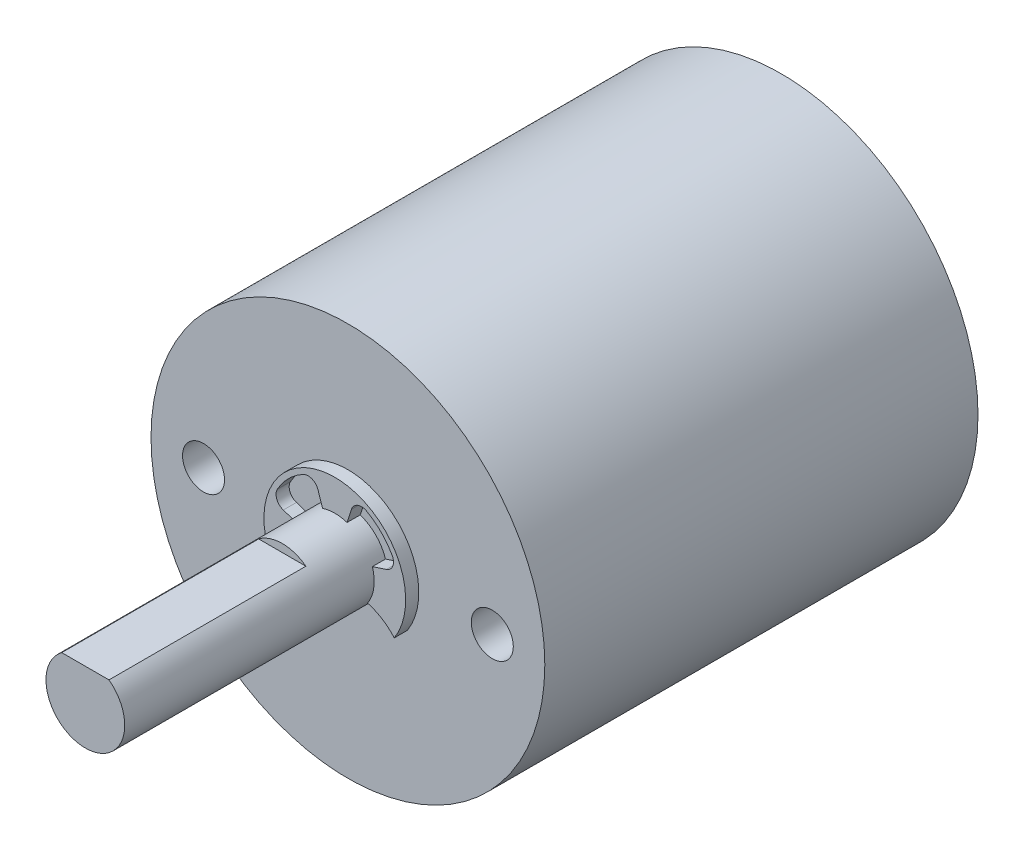
ISO-10303-21;
HEADER;
FILE_DESCRIPTION(('STEP AP214'),'2;1');
FILE_NAME('part.step','',(''),(''),'','','');
FILE_SCHEMA(('AUTOMOTIVE_DESIGN { 1 0 10303 214 1 1 1 1 }'));
ENDSEC;
DATA;
#1=APPLICATION_CONTEXT('core data for automotive mechanical design processes');
#2=APPLICATION_PROTOCOL_DEFINITION('international standard','automotive_design',2000,#1);
#3=PRODUCT_CONTEXT('',#1,'mechanical');
#4=PRODUCT('Part','Part','',(#3));
#5=PRODUCT_RELATED_PRODUCT_CATEGORY('part','',(#4));
#6=PRODUCT_DEFINITION_FORMATION('','',#4);
#7=PRODUCT_DEFINITION_CONTEXT('part definition',#1,'design');
#8=PRODUCT_DEFINITION('design','',#6,#7);
#9=PRODUCT_DEFINITION_SHAPE('','',#8);
#10=(LENGTH_UNIT() NAMED_UNIT(*) SI_UNIT(.MILLI.,.METRE.));
#11=(NAMED_UNIT(*) PLANE_ANGLE_UNIT() SI_UNIT($,.RADIAN.));
#12=(NAMED_UNIT(*) SI_UNIT($,.STERADIAN.) SOLID_ANGLE_UNIT());
#13=UNCERTAINTY_MEASURE_WITH_UNIT(LENGTH_MEASURE(1.E-05),#10,'distance_accuracy_value','');
#14=(GEOMETRIC_REPRESENTATION_CONTEXT(3) GLOBAL_UNCERTAINTY_ASSIGNED_CONTEXT((#13)) GLOBAL_UNIT_ASSIGNED_CONTEXT((#10,
#11,#12)) REPRESENTATION_CONTEXT('',''));
#15=CARTESIAN_POINT('',(0.,0.,0.));
#16=DIRECTION('',(0.,0.,1.));
#17=DIRECTION('',(1.,0.,0.));
#18=AXIS2_PLACEMENT_3D('',#15,#16,#17);
#19=CARTESIAN_POINT('',(0.,0.,16.5));
#20=DIRECTION('',(0.,0.,1.));
#21=DIRECTION('',(1.,0.,0.));
#22=AXIS2_PLACEMENT_3D('',#19,#20,#21);
#23=PLANE('',#22);
#24=CARTESIAN_POINT('',(-1.83676089576645,1.00401907909072,16.5));
#25=DIRECTION('',(0.,0.,1.));
#26=DIRECTION('',(1.,0.,0.));
#27=AXIS2_PLACEMENT_3D('',#24,#25,#26);
#28=CIRCLE('',#27,0.400000000000001);
#29=CARTESIAN_POINT('',(-2.18667450311092,1.19782430965785,16.5));
#30=VERTEX_POINT('',#29);
#31=CARTESIAN_POINT('',(-1.96036769351643,0.623596472572655,16.5));
#32=VERTEX_POINT('',#31);
#33=EDGE_CURVE('E436',#30,#32,#28,.T.);
#34=ORIENTED_EDGE('',*,*,#33,.T.);
#35=DIRECTION('',(-0.951056516295153,0.309016994374948,0.));
#36=VECTOR('',#35,1.);
#37=CARTESIAN_POINT('',(-1.42629923165072,0.450067110175673,16.5));
#38=LINE('',#37,#36);
#39=CARTESIAN_POINT('',(-1.43046160150394,0.45141954612399,16.5));
#40=VERTEX_POINT('',#39);
#41=EDGE_CURVE('E439',#40,#32,#38,.T.);
#42=ORIENTED_EDGE('',*,*,#41,.F.);
#43=CARTESIAN_POINT('',(0.,0.,16.5));
#44=DIRECTION('',(0.,0.,1.));
#45=DIRECTION('',(1.,0.,0.));
#46=AXIS2_PLACEMENT_3D('',#43,#44,#45);
#47=CIRCLE('',#46,1.5);
#48=CARTESIAN_POINT('',(-0.467220978197521,1.42537874178485,16.5));
#49=VERTEX_POINT('',#48);
#50=EDGE_CURVE('E235',#49,#40,#47,.T.);
#51=ORIENTED_EDGE('',*,*,#50,.F.);
#52=DIRECTION('',(0.309016994374941,-0.951056516295156,0.));
#53=VECTOR('',#52,1.);
#54=CARTESIAN_POINT('',(-0.636769311167378,1.9471948549217,16.5));
#55=LINE('',#54,#53);
#56=CARTESIAN_POINT('',(-0.636769311167378,1.9471948549217,16.5));
#57=VERTEX_POINT('',#56);
#58=EDGE_CURVE('E431',#57,#49,#55,.T.);
#59=ORIENTED_EDGE('',*,*,#58,.F.);
#60=CARTESIAN_POINT('',(-1.01719191768544,1.82358805717172,16.5));
#61=DIRECTION('',(0.,0.,1.));
#62=DIRECTION('',(1.,0.,0.));
#63=AXIS2_PLACEMENT_3D('',#60,#61,#62);
#64=CIRCLE('',#63,0.4);
#65=CARTESIAN_POINT('',(-1.21099714825257,2.17350166451619,16.5));
#66=VERTEX_POINT('',#65);
#67=EDGE_CURVE('E433',#57,#66,#64,.T.);
#68=ORIENTED_EDGE('',*,*,#67,.T.);
#69=CARTESIAN_POINT('',(0.0002855427920119,-0.01345838138675,16.5));
#70=DIRECTION('',(0.,0.,1.));
#71=DIRECTION('',(1.,0.,0.));
#72=AXIS2_PLACEMENT_3D('',#69,#70,#71);
#73=CIRCLE('',#72,2.5);
#74=EDGE_CURVE('E388',#66,#30,#73,.T.);
#75=ORIENTED_EDGE('',*,*,#74,.T.);
#76=EDGE_LOOP('',(#34,#42,#51,#59,#68,#75));
#77=FACE_BOUND('',#76,.T.);
#78=ADVANCED_FACE('F38',(#77),#23,.T.);
#79=CARTESIAN_POINT('',(0.,0.,16.5));
#80=DIRECTION('',(0.,0.,1.));
#81=DIRECTION('',(1.,0.,0.));
#82=AXIS2_PLACEMENT_3D('',#79,#80,#81);
#83=CIRCLE('',#82,7.5);
#84=CARTESIAN_POINT('',(7.5,0.,16.5));
#85=VERTEX_POINT('',#84);
#86=EDGE_CURVE('E236',#85,#85,#83,.T.);
#87=ORIENTED_EDGE('',*,*,#86,.T.);
#88=EDGE_LOOP('',(#87));
#89=FACE_BOUND('',#88,.T.);
#90=CARTESIAN_POINT('',(-5.5,0.,16.5));
#91=DIRECTION('',(0.,0.,1.));
#92=DIRECTION('',(1.,0.,0.));
#93=AXIS2_PLACEMENT_3D('',#90,#91,#92);
#94=CIRCLE('',#93,0.799999999999999);
#95=CARTESIAN_POINT('',(-4.7,0.,16.5));
#96=VERTEX_POINT('',#95);
#97=EDGE_CURVE('E215',#96,#96,#94,.T.);
#98=ORIENTED_EDGE('',*,*,#97,.F.);
#99=EDGE_LOOP('',(#98));
#100=FACE_BOUND('',#99,.T.);
#101=CARTESIAN_POINT('',(5.5,0.,16.5));
#102=DIRECTION('',(0.,0.,1.));
#103=DIRECTION('',(1.,0.,0.));
#104=AXIS2_PLACEMENT_3D('',#101,#102,#103);
#105=CIRCLE('',#104,0.799999999999999);
#106=CARTESIAN_POINT('',(6.3,0.,16.5));
#107=VERTEX_POINT('',#106);
#108=EDGE_CURVE('E202',#107,#107,#105,.T.);
#109=ORIENTED_EDGE('',*,*,#108,.F.);
#110=EDGE_LOOP('',(#109));
#111=FACE_BOUND('',#110,.T.);
#112=CARTESIAN_POINT('',(0.0002855427920119,-0.01345838138675,16.5));
#113=DIRECTION('',(0.,0.,1.));
#114=DIRECTION('',(1.,0.,0.));
#115=AXIS2_PLACEMENT_3D('',#112,#113,#114);
#116=CIRCLE('',#115,1.5);
#117=CARTESIAN_POINT('',(-1.49950463296713,-0.0385467989606781,16.5));
#118=VERTEX_POINT('',#117);
#119=CARTESIAN_POINT('',(-1.24971445720799,-0.8426145789756,16.5));
#120=VERTEX_POINT('',#119);
#121=EDGE_CURVE('E441',#118,#120,#116,.T.);
#122=ORIENTED_EDGE('',*,*,#121,.T.);
#123=CARTESIAN_POINT('',(-2.26533077301168,-1.48212536527524,16.5));
#124=CARTESIAN_POINT('',(-1.93535190043993,-0.830261295591717,16.5));
#125=CARTESIAN_POINT('',(-1.24971445720799,-0.8426145789756,16.5));
#126=B_SPLINE_CURVE_WITH_KNOTS('',2,(#123,#124,#125),.UNSPECIFIED.,.F.,.F.,(3,3),(0.,1.),.UNSPECIFIED.);
#127=CARTESIAN_POINT('',(-2.26533077301168,-1.48212536527524,16.5));
#128=VERTEX_POINT('',#127);
#129=EDGE_CURVE('E200',#128,#120,#126,.T.);
#130=ORIENTED_EDGE('',*,*,#129,.F.);
#131=CARTESIAN_POINT('',(0.0002855427920119,-0.01345838138675,16.5));
#132=DIRECTION('',(0.,0.,1.));
#133=DIRECTION('',(1.,0.,0.));
#134=AXIS2_PLACEMENT_3D('',#131,#132,#133);
#135=CIRCLE('',#134,2.7);
#136=CARTESIAN_POINT('',(2.2659018585957,-1.48212536527524,16.5));
#137=VERTEX_POINT('',#136);
#138=EDGE_CURVE('E196',#137,#128,#135,.T.);
#139=ORIENTED_EDGE('',*,*,#138,.F.);
#140=CARTESIAN_POINT('',(1.25028554279201,-0.8426145789756,16.5));
#141=CARTESIAN_POINT('',(1.85011088192155,-1.01141829303744,16.5));
#142=CARTESIAN_POINT('',(2.2659018585957,-1.48212536527524,16.5));
#143=B_SPLINE_CURVE_WITH_KNOTS('',2,(#140,#141,#142),.UNSPECIFIED.,.F.,.F.,(3,3),(0.,1.),.UNSPECIFIED.);
#144=CARTESIAN_POINT('',(1.25028554279201,-0.8426145789756,16.5));
#145=VERTEX_POINT('',#144);
#146=EDGE_CURVE('E408',#145,#137,#143,.T.);
#147=ORIENTED_EDGE('',*,*,#146,.F.);
#148=CARTESIAN_POINT('',(0.0002855427920119,-0.01345838138675,16.5));
#149=DIRECTION('',(0.,0.,1.));
#150=DIRECTION('',(1.,0.,0.));
#151=AXIS2_PLACEMENT_3D('',#148,#149,#150);
#152=CIRCLE('',#151,1.5);
#153=CARTESIAN_POINT('',(1.49979017575914,0.0250884175739281,16.5));
#154=VERTEX_POINT('',#153);
#155=EDGE_CURVE('E412',#145,#154,#152,.T.);
#156=ORIENTED_EDGE('',*,*,#155,.T.);
#157=EDGE_CURVE('E232',#118,#154,#47,.T.);
#158=ORIENTED_EDGE('',*,*,#157,.F.);
#159=EDGE_LOOP('',(#122,#130,#139,#147,#156,#158));
#160=FACE_BOUND('',#159,.T.);
#161=ADVANCED_FACE('F449',(#89,#100,#111,#160),#23,.T.);
#162=CARTESIAN_POINT('',(0.,0.,26.5));
#163=DIRECTION('',(0.,0.,-1.));
#164=DIRECTION('',(-1.,0.,0.));
#165=AXIS2_PLACEMENT_3D('',#162,#163,#164);
#166=CYLINDRICAL_SURFACE('',#165,1.5);
#167=CARTESIAN_POINT('',(0.,0.,26.5));
#168=DIRECTION('',(0.,0.,1.));
#169=DIRECTION('',(1.,0.,0.));
#170=AXIS2_PLACEMENT_3D('',#167,#168,#169);
#171=CIRCLE('',#170,1.5);
#172=CARTESIAN_POINT('',(-0.9,1.2,26.5));
#173=VERTEX_POINT('',#172);
#174=CARTESIAN_POINT('',(0.9,1.2,26.5));
#175=VERTEX_POINT('',#174);
#176=EDGE_CURVE('E228',#173,#175,#171,.T.);
#177=ORIENTED_EDGE('',*,*,#176,.F.);
#178=DIRECTION('',(0.,0.,-1.));
#179=VECTOR('',#178,1.);
#180=CARTESIAN_POINT('',(-0.9,1.2,26.5));
#181=LINE('',#180,#179);
#182=CARTESIAN_POINT('',(-0.9,1.2,19.));
#183=VERTEX_POINT('',#182);
#184=EDGE_CURVE('E61',#173,#183,#181,.T.);
#185=ORIENTED_EDGE('',*,*,#184,.T.);
#186=CARTESIAN_POINT('',(0.,0.,19.));
#187=DIRECTION('',(0.,0.,-1.));
#188=DIRECTION('',(-1.,0.,0.));
#189=AXIS2_PLACEMENT_3D('',#186,#187,#188);
#190=CIRCLE('',#189,1.5);
#191=CARTESIAN_POINT('',(0.9,1.2,19.));
#192=VERTEX_POINT('',#191);
#193=EDGE_CURVE('E244',#183,#192,#190,.T.);
#194=ORIENTED_EDGE('',*,*,#193,.T.);
#195=DIRECTION('',(0.,0.,-1.));
#196=VECTOR('',#195,1.);
#197=CARTESIAN_POINT('',(0.9,1.2,26.5));
#198=LINE('',#197,#196);
#199=EDGE_CURVE('E224',#192,#175,#198,.F.);
#200=ORIENTED_EDGE('',*,*,#199,.T.);
#201=EDGE_LOOP('',(#177,#185,#194,#200));
#202=FACE_BOUND('',#201,.T.);
#203=DIRECTION('',(0.,0.,-1.));
#204=VECTOR('',#203,1.);
#205=CARTESIAN_POINT('',(1.43051470309185,0.45125124292132,26.5));
#206=LINE('',#205,#204);
#207=CARTESIAN_POINT('',(1.43051470309185,0.45125124292132,16.5));
#208=VERTEX_POINT('',#207);
#209=CARTESIAN_POINT('',(1.43051470309185,0.45125124292132,17.));
#210=VERTEX_POINT('',#209);
#211=EDGE_CURVE('E11',#208,#210,#206,.F.);
#212=ORIENTED_EDGE('',*,*,#211,.F.);
#213=CARTESIAN_POINT('',(0.467737064615412,1.42520947175668,16.5));
#214=VERTEX_POINT('',#213);
#215=EDGE_CURVE('E237',#208,#214,#47,.T.);
#216=ORIENTED_EDGE('',*,*,#215,.T.);
#217=DIRECTION('',(0.,0.,-1.));
#218=VECTOR('',#217,1.);
#219=CARTESIAN_POINT('',(0.467737064615412,1.42520947175668,26.5));
#220=LINE('',#219,#218);
#221=CARTESIAN_POINT('',(0.467737064615412,1.42520947175668,17.));
#222=VERTEX_POINT('',#221);
#223=EDGE_CURVE('E254',#222,#214,#220,.T.);
#224=ORIENTED_EDGE('',*,*,#223,.F.);
#225=CARTESIAN_POINT('',(0.,0.,17.));
#226=DIRECTION('',(0.,0.,1.));
#227=DIRECTION('',(1.,0.,0.));
#228=AXIS2_PLACEMENT_3D('',#225,#226,#227);
#229=CIRCLE('',#228,1.5);
#230=CARTESIAN_POINT('',(-0.467220978197521,1.42537874178485,17.));
#231=VERTEX_POINT('',#230);
#232=EDGE_CURVE('E251',#222,#231,#229,.T.);
#233=ORIENTED_EDGE('',*,*,#232,.T.);
#234=DIRECTION('',(0.,0.,-1.));
#235=VECTOR('',#234,1.);
#236=CARTESIAN_POINT('',(-0.467220978197521,1.42537874178485,26.5));
#237=LINE('',#236,#235);
#238=EDGE_CURVE('E256',#49,#231,#237,.F.);
#239=ORIENTED_EDGE('',*,*,#238,.F.);
#240=ORIENTED_EDGE('',*,*,#50,.T.);
#241=DIRECTION('',(0.,0.,-1.));
#242=VECTOR('',#241,1.);
#243=CARTESIAN_POINT('',(-1.43046160150394,0.45141954612399,26.5));
#244=LINE('',#243,#242);
#245=CARTESIAN_POINT('',(-1.43046160150394,0.45141954612399,17.));
#246=VERTEX_POINT('',#245);
#247=EDGE_CURVE('E249',#246,#40,#244,.T.);
#248=ORIENTED_EDGE('',*,*,#247,.F.);
#249=CARTESIAN_POINT('',(-1.49950463296713,-0.0385467989606781,17.));
#250=VERTEX_POINT('',#249);
#251=EDGE_CURVE('E247',#246,#250,#229,.T.);
#252=ORIENTED_EDGE('',*,*,#251,.T.);
#253=DIRECTION('',(0.,0.,-1.));
#254=VECTOR('',#253,1.);
#255=CARTESIAN_POINT('',(-1.49950463296713,-0.0385467989606781,16.75));
#256=LINE('',#255,#254);
#257=EDGE_CURVE('E184',#250,#118,#256,.T.);
#258=ORIENTED_EDGE('',*,*,#257,.T.);
#259=ORIENTED_EDGE('',*,*,#157,.T.);
#260=DIRECTION('',(0.,0.,-1.));
#261=VECTOR('',#260,1.);
#262=CARTESIAN_POINT('',(1.49979017575914,0.0250884175739281,16.75));
#263=LINE('',#262,#261);
#264=CARTESIAN_POINT('',(1.49979017575914,0.0250884175739281,17.));
#265=VERTEX_POINT('',#264);
#266=EDGE_CURVE('E46',#154,#265,#263,.F.);
#267=ORIENTED_EDGE('',*,*,#266,.T.);
#268=EDGE_CURVE('E250',#265,#210,#229,.T.);
#269=ORIENTED_EDGE('',*,*,#268,.T.);
#270=EDGE_LOOP('',(#212,#216,#224,#233,#239,#240,#248,#252,#258,#259,#267,#269));
#271=FACE_BOUND('',#270,.T.);
#272=ADVANCED_FACE('F264',(#202,#271),#166,.T.);
#273=CARTESIAN_POINT('',(0.,0.,16.5));
#274=DIRECTION('',(0.,0.,-1.));
#275=DIRECTION('',(-1.,0.,0.));
#276=AXIS2_PLACEMENT_3D('',#273,#274,#275);
#277=CYLINDRICAL_SURFACE('',#276,7.5);
#278=ORIENTED_EDGE('',*,*,#86,.F.);
#279=EDGE_LOOP('',(#278));
#280=FACE_BOUND('',#279,.T.);
#281=CARTESIAN_POINT('',(0.,0.,0.));
#282=DIRECTION('',(0.,0.,1.));
#283=DIRECTION('',(1.,0.,0.));
#284=AXIS2_PLACEMENT_3D('',#281,#282,#283);
#285=CIRCLE('',#284,7.5);
#286=CARTESIAN_POINT('',(7.5,0.,0.));
#287=VERTEX_POINT('',#286);
#288=EDGE_CURVE('E231',#287,#287,#285,.T.);
#289=ORIENTED_EDGE('',*,*,#288,.T.);
#290=EDGE_LOOP('',(#289));
#291=FACE_BOUND('',#290,.T.);
#292=ADVANCED_FACE('F40',(#280,#291),#277,.T.);
#293=CARTESIAN_POINT('',(1.01776300326946,1.82358805717172,16.5));
#294=DIRECTION('',(0.,0.,1.));
#295=DIRECTION('',(1.,0.,0.));
#296=AXIS2_PLACEMENT_3D('',#293,#294,#295);
#297=CIRCLE('',#296,0.4);
#298=CARTESIAN_POINT('',(1.2115682338366,2.17350166451619,16.5));
#299=VERTEX_POINT('',#298);
#300=CARTESIAN_POINT('',(0.637340396751401,1.9471948549217,16.5));
#301=VERTEX_POINT('',#300);
#302=EDGE_CURVE('E426',#299,#301,#297,.T.);
#303=ORIENTED_EDGE('',*,*,#302,.T.);
#304=DIRECTION('',(0.30901699437494,0.951056516295156,0.));
#305=VECTOR('',#304,1.);
#306=CARTESIAN_POINT('',(0.463811034354423,1.41312639305598,16.5));
#307=LINE('',#306,#305);
#308=EDGE_CURVE('E429',#214,#301,#307,.T.);
#309=ORIENTED_EDGE('',*,*,#308,.F.);
#310=ORIENTED_EDGE('',*,*,#215,.F.);
#311=DIRECTION('',(-0.951056516295153,-0.30901699437495,0.));
#312=VECTOR('',#311,1.);
#313=CARTESIAN_POINT('',(1.96093877910045,0.623596472572656,16.5));
#314=LINE('',#313,#312);
#315=CARTESIAN_POINT('',(1.96093877910045,0.623596472572656,16.5));
#316=VERTEX_POINT('',#315);
#317=EDGE_CURVE('E418',#316,#208,#314,.T.);
#318=ORIENTED_EDGE('',*,*,#317,.F.);
#319=CARTESIAN_POINT('',(1.83733198135047,1.00401907909072,16.5));
#320=DIRECTION('',(0.,0.,1.));
#321=DIRECTION('',(1.,0.,0.));
#322=AXIS2_PLACEMENT_3D('',#319,#320,#321);
#323=CIRCLE('',#322,0.4);
#324=CARTESIAN_POINT('',(2.18724558869494,1.19782430965785,16.5));
#325=VERTEX_POINT('',#324);
#326=EDGE_CURVE('E420',#316,#325,#323,.T.);
#327=ORIENTED_EDGE('',*,*,#326,.T.);
#328=CARTESIAN_POINT('',(0.0002855427920119,-0.01345838138675,16.5));
#329=DIRECTION('',(0.,0.,1.));
#330=DIRECTION('',(1.,0.,0.));
#331=AXIS2_PLACEMENT_3D('',#328,#329,#330);
#332=CIRCLE('',#331,2.5);
#333=EDGE_CURVE('E423',#325,#299,#332,.T.);
#334=ORIENTED_EDGE('',*,*,#333,.T.);
#335=EDGE_LOOP('',(#303,#309,#310,#318,#327,#334));
#336=FACE_BOUND('',#335,.T.);
#337=ADVANCED_FACE('F460',(#336),#23,.T.);
#338=CARTESIAN_POINT('',(0.,0.,0.));
#339=DIRECTION('',(0.,0.,1.));
#340=DIRECTION('',(1.,0.,0.));
#341=AXIS2_PLACEMENT_3D('',#338,#339,#340);
#342=PLANE('',#341);
#343=ORIENTED_EDGE('',*,*,#288,.F.);
#344=EDGE_LOOP('',(#343));
#345=FACE_BOUND('',#344,.T.);
#346=ADVANCED_FACE('F485',(#345),#342,.F.);
#347=CARTESIAN_POINT('',(0.,0.,26.5));
#348=DIRECTION('',(0.,0.,1.));
#349=DIRECTION('',(1.,0.,0.));
#350=AXIS2_PLACEMENT_3D('',#347,#348,#349);
#351=PLANE('',#350);
#352=DIRECTION('',(1.,0.,0.));
#353=VECTOR('',#352,1.);
#354=CARTESIAN_POINT('',(0.,1.2,26.5));
#355=LINE('',#354,#353);
#356=EDGE_CURVE('E242',#173,#175,#355,.T.);
#357=ORIENTED_EDGE('',*,*,#356,.F.);
#358=ORIENTED_EDGE('',*,*,#176,.T.);
#359=EDGE_LOOP('',(#357,#358));
#360=FACE_BOUND('',#359,.T.);
#361=ADVANCED_FACE('F490',(#360),#351,.T.);
#362=CARTESIAN_POINT('',(0.,0.,19.));
#363=DIRECTION('',(0.,0.,-1.));
#364=DIRECTION('',(-1.,0.,0.));
#365=AXIS2_PLACEMENT_3D('',#362,#363,#364);
#366=PLANE('',#365);
#367=DIRECTION('',(1.,0.,0.));
#368=VECTOR('',#367,1.);
#369=CARTESIAN_POINT('',(2.16759253793726,1.2,19.));
#370=LINE('',#369,#368);
#371=EDGE_CURVE('E221',#183,#192,#370,.T.);
#372=ORIENTED_EDGE('',*,*,#371,.T.);
#373=ORIENTED_EDGE('',*,*,#193,.F.);
#374=EDGE_LOOP('',(#372,#373));
#375=FACE_BOUND('',#374,.T.);
#376=ADVANCED_FACE('F526',(#375),#366,.F.);
#377=CARTESIAN_POINT('',(2.16759253793726,1.2,19.));
#378=DIRECTION('',(0.,-1.,0.));
#379=DIRECTION('',(0.,0.,-1.));
#380=AXIS2_PLACEMENT_3D('',#377,#378,#379);
#381=PLANE('',#380);
#382=ORIENTED_EDGE('',*,*,#356,.T.);
#383=ORIENTED_EDGE('',*,*,#199,.F.);
#384=ORIENTED_EDGE('',*,*,#371,.F.);
#385=ORIENTED_EDGE('',*,*,#184,.F.);
#386=EDGE_LOOP('',(#382,#383,#384,#385));
#387=FACE_BOUND('',#386,.T.);
#388=ADVANCED_FACE('F524',(#387),#381,.F.);
#389=CARTESIAN_POINT('',(-5.5,0.,10.5));
#390=DIRECTION('',(0.,0.,1.));
#391=DIRECTION('',(1.,0.,0.));
#392=AXIS2_PLACEMENT_3D('',#389,#390,#391);
#393=CONICAL_SURFACE('',#392,0.799999999999999,1.0471975511966);
#394=CARTESIAN_POINT('',(-5.5,0.,10.0381197846483));
#395=VERTEX_POINT('',#394);
#396=VERTEX_LOOP('',#395);
#397=FACE_BOUND('',#396,.T.);
#398=CARTESIAN_POINT('',(-5.5,0.,10.5));
#399=DIRECTION('',(0.,0.,1.));
#400=DIRECTION('',(1.,0.,0.));
#401=AXIS2_PLACEMENT_3D('',#398,#399,#400);
#402=CIRCLE('',#401,0.799999999999999);
#403=CARTESIAN_POINT('',(-4.7,0.,10.5));
#404=VERTEX_POINT('',#403);
#405=EDGE_CURVE('E218',#404,#404,#402,.T.);
#406=ORIENTED_EDGE('',*,*,#405,.T.);
#407=EDGE_LOOP('',(#406));
#408=FACE_BOUND('',#407,.T.);
#409=ADVANCED_FACE('F518',(#397,#408),#393,.F.);
#410=CARTESIAN_POINT('',(-5.5,0.,16.5));
#411=DIRECTION('',(0.,0.,1.));
#412=DIRECTION('',(1.,0.,0.));
#413=AXIS2_PLACEMENT_3D('',#410,#411,#412);
#414=CYLINDRICAL_SURFACE('',#413,0.799999999999999);
#415=ORIENTED_EDGE('',*,*,#405,.F.);
#416=EDGE_LOOP('',(#415));
#417=FACE_BOUND('',#416,.T.);
#418=ORIENTED_EDGE('',*,*,#97,.T.);
#419=EDGE_LOOP('',(#418));
#420=FACE_BOUND('',#419,.T.);
#421=ADVANCED_FACE('F511',(#417,#420),#414,.F.);
#422=CARTESIAN_POINT('',(5.5,0.,10.5));
#423=DIRECTION('',(0.,0.,1.));
#424=DIRECTION('',(1.,0.,0.));
#425=AXIS2_PLACEMENT_3D('',#422,#423,#424);
#426=CONICAL_SURFACE('',#425,0.799999999999999,1.0471975511966);
#427=CARTESIAN_POINT('',(5.5,0.,10.0381197846483));
#428=VERTEX_POINT('',#427);
#429=VERTEX_LOOP('',#428);
#430=FACE_BOUND('',#429,.T.);
#431=CARTESIAN_POINT('',(5.5,0.,10.5));
#432=DIRECTION('',(0.,0.,1.));
#433=DIRECTION('',(1.,0.,0.));
#434=AXIS2_PLACEMENT_3D('',#431,#432,#433);
#435=CIRCLE('',#434,0.799999999999999);
#436=CARTESIAN_POINT('',(6.3,0.,10.5));
#437=VERTEX_POINT('',#436);
#438=EDGE_CURVE('E206',#437,#437,#435,.T.);
#439=ORIENTED_EDGE('',*,*,#438,.T.);
#440=EDGE_LOOP('',(#439));
#441=FACE_BOUND('',#440,.T.);
#442=ADVANCED_FACE('F506',(#430,#441),#426,.F.);
#443=CARTESIAN_POINT('',(5.5,0.,16.5));
#444=DIRECTION('',(0.,0.,1.));
#445=DIRECTION('',(1.,0.,0.));
#446=AXIS2_PLACEMENT_3D('',#443,#444,#445);
#447=CYLINDRICAL_SURFACE('',#446,0.799999999999999);
#448=ORIENTED_EDGE('',*,*,#438,.F.);
#449=EDGE_LOOP('',(#448));
#450=FACE_BOUND('',#449,.T.);
#451=ORIENTED_EDGE('',*,*,#108,.T.);
#452=EDGE_LOOP('',(#451));
#453=FACE_BOUND('',#452,.T.);
#454=ADVANCED_FACE('F362',(#450,#453),#447,.F.);
#455=CARTESIAN_POINT('',(0.0002855427920119,-0.01345838138675,17.));
#456=DIRECTION('',(0.,0.,-1.));
#457=DIRECTION('',(-1.,0.,0.));
#458=AXIS2_PLACEMENT_3D('',#455,#456,#457);
#459=CYLINDRICAL_SURFACE('',#458,1.5);
#460=ORIENTED_EDGE('',*,*,#257,.F.);
#461=CARTESIAN_POINT('',(0.0002855427920119,-0.01345838138675,17.));
#462=DIRECTION('',(0.,0.,1.));
#463=DIRECTION('',(1.,0.,0.));
#464=AXIS2_PLACEMENT_3D('',#461,#462,#463);
#465=CIRCLE('',#464,1.5);
#466=CARTESIAN_POINT('',(-1.24971445720799,-0.8426145789756,17.));
#467=VERTEX_POINT('',#466);
#468=EDGE_CURVE('E53',#250,#467,#465,.T.);
#469=ORIENTED_EDGE('',*,*,#468,.T.);
#470=DIRECTION('',(0.,0.,-1.));
#471=VECTOR('',#470,1.);
#472=CARTESIAN_POINT('',(-1.24971445720799,-0.8426145789756,17.));
#473=LINE('',#472,#471);
#474=EDGE_CURVE('E181',#467,#120,#473,.T.);
#475=ORIENTED_EDGE('',*,*,#474,.T.);
#476=ORIENTED_EDGE('',*,*,#121,.F.);
#477=EDGE_LOOP('',(#460,#469,#475,#476));
#478=FACE_BOUND('',#477,.T.);
#479=ADVANCED_FACE('F179',(#478),#459,.F.);
#480=CARTESIAN_POINT('',(-1.42629923165072,0.450067110175673,17.));
#481=DIRECTION('',(-0.309016994374948,-0.951056516295153,0.));
#482=DIRECTION('',(0.951056516295154,-0.309016994374948,0.));
#483=AXIS2_PLACEMENT_3D('',#480,#481,#482);
#484=PLANE('',#483);
#485=DIRECTION('',(-0.951056516295153,0.309016994374948,0.));
#486=VECTOR('',#485,1.);
#487=CARTESIAN_POINT('',(-1.42629923165072,0.450067110175673,17.));
#488=LINE('',#487,#486);
#489=CARTESIAN_POINT('',(-1.96036769351643,0.623596472572655,17.));
#490=VERTEX_POINT('',#489);
#491=EDGE_CURVE('E186',#246,#490,#488,.T.);
#492=ORIENTED_EDGE('',*,*,#491,.F.);
#493=ORIENTED_EDGE('',*,*,#247,.T.);
#494=ORIENTED_EDGE('',*,*,#41,.T.);
#495=DIRECTION('',(0.,0.,-1.));
#496=VECTOR('',#495,1.);
#497=CARTESIAN_POINT('',(-1.96036769351643,0.623596472572655,17.));
#498=LINE('',#497,#496);
#499=EDGE_CURVE('E203',#490,#32,#498,.T.);
#500=ORIENTED_EDGE('',*,*,#499,.F.);
#501=EDGE_LOOP('',(#492,#493,#494,#500));
#502=FACE_BOUND('',#501,.T.);
#503=ADVANCED_FACE('F344',(#502),#484,.F.);
#504=CARTESIAN_POINT('',(-0.636769311167378,1.9471948549217,17.));
#505=DIRECTION('',(0.951056516295156,0.309016994374941,0.));
#506=DIRECTION('',(-0.309016994374941,0.951056516295156,0.));
#507=AXIS2_PLACEMENT_3D('',#504,#505,#506);
#508=PLANE('',#507);
#509=ORIENTED_EDGE('',*,*,#58,.T.);
#510=ORIENTED_EDGE('',*,*,#238,.T.);
#511=DIRECTION('',(0.309016994374941,-0.951056516295156,0.));
#512=VECTOR('',#511,1.);
#513=CARTESIAN_POINT('',(-0.636769311167378,1.9471948549217,17.));
#514=LINE('',#513,#512);
#515=CARTESIAN_POINT('',(-0.636769311167378,1.9471948549217,17.));
#516=VERTEX_POINT('',#515);
#517=EDGE_CURVE('E275',#516,#231,#514,.T.);
#518=ORIENTED_EDGE('',*,*,#517,.F.);
#519=DIRECTION('',(0.,0.,-1.));
#520=VECTOR('',#519,1.);
#521=CARTESIAN_POINT('',(-0.636769311167378,1.9471948549217,17.));
#522=LINE('',#521,#520);
#523=EDGE_CURVE('E383',#516,#57,#522,.T.);
#524=ORIENTED_EDGE('',*,*,#523,.T.);
#525=EDGE_LOOP('',(#509,#510,#518,#524));
#526=FACE_BOUND('',#525,.T.);
#527=ADVANCED_FACE('F341',(#526),#508,.F.);
#528=CARTESIAN_POINT('',(0.463811034354423,1.41312639305598,17.));
#529=DIRECTION('',(-0.951056516295156,0.30901699437494,0.));
#530=DIRECTION('',(-0.30901699437494,-0.951056516295156,0.));
#531=AXIS2_PLACEMENT_3D('',#528,#529,#530);
#532=PLANE('',#531);
#533=DIRECTION('',(0.30901699437494,0.951056516295156,0.));
#534=VECTOR('',#533,1.);
#535=CARTESIAN_POINT('',(0.463811034354423,1.41312639305598,17.));
#536=LINE('',#535,#534);
#537=CARTESIAN_POINT('',(0.637340396751401,1.9471948549217,17.));
#538=VERTEX_POINT('',#537);
#539=EDGE_CURVE('E271',#222,#538,#536,.T.);
#540=ORIENTED_EDGE('',*,*,#539,.F.);
#541=ORIENTED_EDGE('',*,*,#223,.T.);
#542=ORIENTED_EDGE('',*,*,#308,.T.);
#543=DIRECTION('',(0.,0.,-1.));
#544=VECTOR('',#543,1.);
#545=CARTESIAN_POINT('',(0.637340396751401,1.9471948549217,17.));
#546=LINE('',#545,#544);
#547=EDGE_CURVE('E280',#538,#301,#546,.T.);
#548=ORIENTED_EDGE('',*,*,#547,.F.);
#549=EDGE_LOOP('',(#540,#541,#542,#548));
#550=FACE_BOUND('',#549,.T.);
#551=ADVANCED_FACE('F277',(#550),#532,.F.);
#552=CARTESIAN_POINT('',(1.96093877910045,0.623596472572656,17.));
#553=DIRECTION('',(0.30901699437495,-0.951056516295153,0.));
#554=DIRECTION('',(0.951056516295153,0.30901699437495,0.));
#555=AXIS2_PLACEMENT_3D('',#552,#553,#554);
#556=PLANE('',#555);
#557=ORIENTED_EDGE('',*,*,#317,.T.);
#558=ORIENTED_EDGE('',*,*,#211,.T.);
#559=DIRECTION('',(-0.951056516295153,-0.30901699437495,0.));
#560=VECTOR('',#559,1.);
#561=CARTESIAN_POINT('',(1.96093877910045,0.623596472572656,17.));
#562=LINE('',#561,#560);
#563=CARTESIAN_POINT('',(1.96093877910045,0.623596472572656,17.));
#564=VERTEX_POINT('',#563);
#565=EDGE_CURVE('E295',#564,#210,#562,.T.);
#566=ORIENTED_EDGE('',*,*,#565,.F.);
#567=DIRECTION('',(0.,0.,-1.));
#568=VECTOR('',#567,1.);
#569=CARTESIAN_POINT('',(1.96093877910045,0.623596472572656,17.));
#570=LINE('',#569,#568);
#571=EDGE_CURVE('E398',#564,#316,#570,.T.);
#572=ORIENTED_EDGE('',*,*,#571,.T.);
#573=EDGE_LOOP('',(#557,#558,#566,#572));
#574=FACE_BOUND('',#573,.T.);
#575=ADVANCED_FACE('F322',(#574),#556,.F.);
#576=CARTESIAN_POINT('',(0.0002855427920119,-0.01345838138675,17.));
#577=DIRECTION('',(0.,0.,-1.));
#578=DIRECTION('',(-1.,0.,0.));
#579=AXIS2_PLACEMENT_3D('',#576,#577,#578);
#580=CYLINDRICAL_SURFACE('',#579,1.5);
#581=ORIENTED_EDGE('',*,*,#266,.F.);
#582=ORIENTED_EDGE('',*,*,#155,.F.);
#583=DIRECTION('',(0.,0.,-1.));
#584=VECTOR('',#583,1.);
#585=CARTESIAN_POINT('',(1.25028554279201,-0.8426145789756,17.));
#586=LINE('',#585,#584);
#587=CARTESIAN_POINT('',(1.25028554279201,-0.8426145789756,17.));
#588=VERTEX_POINT('',#587);
#589=EDGE_CURVE('E400',#588,#145,#586,.T.);
#590=ORIENTED_EDGE('',*,*,#589,.F.);
#591=CARTESIAN_POINT('',(0.0002855427920119,-0.01345838138675,17.));
#592=DIRECTION('',(0.,0.,1.));
#593=DIRECTION('',(1.,0.,0.));
#594=AXIS2_PLACEMENT_3D('',#591,#592,#593);
#595=CIRCLE('',#594,1.5);
#596=EDGE_CURVE('E298',#588,#265,#595,.T.);
#597=ORIENTED_EDGE('',*,*,#596,.T.);
#598=EDGE_LOOP('',(#581,#582,#590,#597));
#599=FACE_BOUND('',#598,.T.);
#600=ADVANCED_FACE('F319',(#599),#580,.F.);
#601=CARTESIAN_POINT('',(-2.26533077301168,-1.48212536527524,17.));
#602=CARTESIAN_POINT('',(-1.93535190043993,-0.830261295591717,17.));
#603=CARTESIAN_POINT('',(-1.24971445720799,-0.8426145789756,17.));
#604=B_SPLINE_CURVE_WITH_KNOTS('',2,(#601,#602,#603),.UNSPECIFIED.,.F.,.F.,(3,3),(0.,1.),.UNSPECIFIED.);
#605=DIRECTION('',(0.,0.,-1.));
#606=VECTOR('',#605,1.);
#607=SURFACE_OF_LINEAR_EXTRUSION('',#604,#606);
#608=ORIENTED_EDGE('',*,*,#129,.T.);
#609=ORIENTED_EDGE('',*,*,#474,.F.);
#610=CARTESIAN_POINT('',(-2.26533077301168,-1.48212536527524,17.));
#611=VERTEX_POINT('',#610);
#612=EDGE_CURVE('E187',#611,#467,#604,.T.);
#613=ORIENTED_EDGE('',*,*,#612,.F.);
#614=DIRECTION('',(0.,0.,-1.));
#615=VECTOR('',#614,1.);
#616=CARTESIAN_POINT('',(-2.26533077301168,-1.48212536527524,17.));
#617=LINE('',#616,#615);
#618=EDGE_CURVE('E405',#611,#128,#617,.T.);
#619=ORIENTED_EDGE('',*,*,#618,.T.);
#620=EDGE_LOOP('',(#608,#609,#613,#619));
#621=FACE_BOUND('',#620,.T.);
#622=ADVANCED_FACE('F198',(#621),#607,.F.);
#623=CARTESIAN_POINT('',(-1.83676089576645,1.00401907909072,17.));
#624=DIRECTION('',(0.,0.,-1.));
#625=DIRECTION('',(-1.,0.,0.));
#626=AXIS2_PLACEMENT_3D('',#623,#624,#625);
#627=CYLINDRICAL_SURFACE('',#626,0.400000000000001);
#628=ORIENTED_EDGE('',*,*,#33,.F.);
#629=DIRECTION('',(0.,0.,-1.));
#630=VECTOR('',#629,1.);
#631=CARTESIAN_POINT('',(-2.18667450311092,1.19782430965785,17.));
#632=LINE('',#631,#630);
#633=CARTESIAN_POINT('',(-2.18667450311092,1.19782430965785,17.));
#634=VERTEX_POINT('',#633);
#635=EDGE_CURVE('E209',#634,#30,#632,.T.);
#636=ORIENTED_EDGE('',*,*,#635,.F.);
#637=CARTESIAN_POINT('',(-1.83676089576645,1.00401907909072,17.));
#638=DIRECTION('',(0.,0.,1.));
#639=DIRECTION('',(1.,0.,0.));
#640=AXIS2_PLACEMENT_3D('',#637,#638,#639);
#641=CIRCLE('',#640,0.400000000000001);
#642=EDGE_CURVE('E374',#634,#490,#641,.T.);
#643=ORIENTED_EDGE('',*,*,#642,.T.);
#644=ORIENTED_EDGE('',*,*,#499,.T.);
#645=EDGE_LOOP('',(#628,#636,#643,#644));
#646=FACE_BOUND('',#645,.T.);
#647=ADVANCED_FACE('F352',(#646),#627,.F.);
#648=CARTESIAN_POINT('',(0.0002855427920119,-0.01345838138675,17.));
#649=DIRECTION('',(0.,0.,-1.));
#650=DIRECTION('',(-1.,0.,0.));
#651=AXIS2_PLACEMENT_3D('',#648,#649,#650);
#652=CYLINDRICAL_SURFACE('',#651,2.5);
#653=ORIENTED_EDGE('',*,*,#74,.F.);
#654=DIRECTION('',(0.,0.,-1.));
#655=VECTOR('',#654,1.);
#656=CARTESIAN_POINT('',(-1.21099714825257,2.17350166451619,17.));
#657=LINE('',#656,#655);
#658=CARTESIAN_POINT('',(-1.21099714825257,2.17350166451619,17.));
#659=VERTEX_POINT('',#658);
#660=EDGE_CURVE('E381',#659,#66,#657,.T.);
#661=ORIENTED_EDGE('',*,*,#660,.F.);
#662=CARTESIAN_POINT('',(0.0002855427920119,-0.01345838138675,17.));
#663=DIRECTION('',(0.,0.,1.));
#664=DIRECTION('',(1.,0.,0.));
#665=AXIS2_PLACEMENT_3D('',#662,#663,#664);
#666=CIRCLE('',#665,2.5);
#667=EDGE_CURVE('E377',#659,#634,#666,.T.);
#668=ORIENTED_EDGE('',*,*,#667,.T.);
#669=ORIENTED_EDGE('',*,*,#635,.T.);
#670=EDGE_LOOP('',(#653,#661,#668,#669));
#671=FACE_BOUND('',#670,.T.);
#672=ADVANCED_FACE('F348',(#671),#652,.F.);
#673=CARTESIAN_POINT('',(-1.01719191768544,1.82358805717172,17.));
#674=DIRECTION('',(0.,0.,-1.));
#675=DIRECTION('',(-1.,0.,0.));
#676=AXIS2_PLACEMENT_3D('',#673,#674,#675);
#677=CYLINDRICAL_SURFACE('',#676,0.4);
#678=ORIENTED_EDGE('',*,*,#67,.F.);
#679=ORIENTED_EDGE('',*,*,#523,.F.);
#680=CARTESIAN_POINT('',(-1.01719191768544,1.82358805717172,17.));
#681=DIRECTION('',(0.,0.,1.));
#682=DIRECTION('',(1.,0.,0.));
#683=AXIS2_PLACEMENT_3D('',#680,#681,#682);
#684=CIRCLE('',#683,0.4);
#685=EDGE_CURVE('E286',#516,#659,#684,.T.);
#686=ORIENTED_EDGE('',*,*,#685,.T.);
#687=ORIENTED_EDGE('',*,*,#660,.T.);
#688=EDGE_LOOP('',(#678,#679,#686,#687));
#689=FACE_BOUND('',#688,.T.);
#690=ADVANCED_FACE('F337',(#689),#677,.F.);
#691=CARTESIAN_POINT('',(1.01776300326946,1.82358805717172,17.));
#692=DIRECTION('',(0.,0.,-1.));
#693=DIRECTION('',(-1.,0.,0.));
#694=AXIS2_PLACEMENT_3D('',#691,#692,#693);
#695=CYLINDRICAL_SURFACE('',#694,0.4);
#696=ORIENTED_EDGE('',*,*,#302,.F.);
#697=DIRECTION('',(0.,0.,-1.));
#698=VECTOR('',#697,1.);
#699=CARTESIAN_POINT('',(1.2115682338366,2.17350166451619,17.));
#700=LINE('',#699,#698);
#701=CARTESIAN_POINT('',(1.2115682338366,2.17350166451619,17.));
#702=VERTEX_POINT('',#701);
#703=EDGE_CURVE('E394',#702,#299,#700,.T.);
#704=ORIENTED_EDGE('',*,*,#703,.F.);
#705=CARTESIAN_POINT('',(1.01776300326946,1.82358805717172,17.));
#706=DIRECTION('',(0.,0.,1.));
#707=DIRECTION('',(1.,0.,0.));
#708=AXIS2_PLACEMENT_3D('',#705,#706,#707);
#709=CIRCLE('',#708,0.4);
#710=EDGE_CURVE('E282',#702,#538,#709,.T.);
#711=ORIENTED_EDGE('',*,*,#710,.T.);
#712=ORIENTED_EDGE('',*,*,#547,.T.);
#713=EDGE_LOOP('',(#696,#704,#711,#712));
#714=FACE_BOUND('',#713,.T.);
#715=ADVANCED_FACE('F333',(#714),#695,.F.);
#716=CARTESIAN_POINT('',(0.0002855427920119,-0.01345838138675,17.));
#717=DIRECTION('',(0.,0.,-1.));
#718=DIRECTION('',(-1.,0.,0.));
#719=AXIS2_PLACEMENT_3D('',#716,#717,#718);
#720=CYLINDRICAL_SURFACE('',#719,2.5);
#721=ORIENTED_EDGE('',*,*,#333,.F.);
#722=DIRECTION('',(0.,0.,-1.));
#723=VECTOR('',#722,1.);
#724=CARTESIAN_POINT('',(2.18724558869494,1.19782430965785,17.));
#725=LINE('',#724,#723);
#726=CARTESIAN_POINT('',(2.18724558869494,1.19782430965785,17.));
#727=VERTEX_POINT('',#726);
#728=EDGE_CURVE('E396',#727,#325,#725,.T.);
#729=ORIENTED_EDGE('',*,*,#728,.F.);
#730=CARTESIAN_POINT('',(0.0002855427920119,-0.01345838138675,17.));
#731=DIRECTION('',(0.,0.,1.));
#732=DIRECTION('',(1.,0.,0.));
#733=AXIS2_PLACEMENT_3D('',#730,#731,#732);
#734=CIRCLE('',#733,2.5);
#735=EDGE_CURVE('E284',#727,#702,#734,.T.);
#736=ORIENTED_EDGE('',*,*,#735,.T.);
#737=ORIENTED_EDGE('',*,*,#703,.T.);
#738=EDGE_LOOP('',(#721,#729,#736,#737));
#739=FACE_BOUND('',#738,.T.);
#740=ADVANCED_FACE('F329',(#739),#720,.F.);
#741=CARTESIAN_POINT('',(1.83733198135047,1.00401907909072,17.));
#742=DIRECTION('',(0.,0.,-1.));
#743=DIRECTION('',(-1.,0.,0.));
#744=AXIS2_PLACEMENT_3D('',#741,#742,#743);
#745=CYLINDRICAL_SURFACE('',#744,0.4);
#746=ORIENTED_EDGE('',*,*,#326,.F.);
#747=ORIENTED_EDGE('',*,*,#571,.F.);
#748=CARTESIAN_POINT('',(1.83733198135047,1.00401907909072,17.));
#749=DIRECTION('',(0.,0.,1.));
#750=DIRECTION('',(1.,0.,0.));
#751=AXIS2_PLACEMENT_3D('',#748,#749,#750);
#752=CIRCLE('',#751,0.4);
#753=EDGE_CURVE('E292',#564,#727,#752,.T.);
#754=ORIENTED_EDGE('',*,*,#753,.T.);
#755=ORIENTED_EDGE('',*,*,#728,.T.);
#756=EDGE_LOOP('',(#746,#747,#754,#755));
#757=FACE_BOUND('',#756,.T.);
#758=ADVANCED_FACE('F316',(#757),#745,.F.);
#759=CARTESIAN_POINT('',(1.25028554279201,-0.8426145789756,17.));
#760=CARTESIAN_POINT('',(1.85011088192155,-1.01141829303744,17.));
#761=CARTESIAN_POINT('',(2.2659018585957,-1.48212536527524,17.));
#762=B_SPLINE_CURVE_WITH_KNOTS('',2,(#759,#760,#761),.UNSPECIFIED.,.F.,.F.,(3,3),(0.,1.),.UNSPECIFIED.);
#763=DIRECTION('',(0.,0.,-1.));
#764=VECTOR('',#763,1.);
#765=SURFACE_OF_LINEAR_EXTRUSION('',#762,#764);
#766=ORIENTED_EDGE('',*,*,#146,.T.);
#767=DIRECTION('',(0.,0.,-1.));
#768=VECTOR('',#767,1.);
#769=CARTESIAN_POINT('',(2.2659018585957,-1.48212536527524,17.));
#770=LINE('',#769,#768);
#771=CARTESIAN_POINT('',(2.2659018585957,-1.48212536527524,17.));
#772=VERTEX_POINT('',#771);
#773=EDGE_CURVE('E402',#772,#137,#770,.T.);
#774=ORIENTED_EDGE('',*,*,#773,.F.);
#775=EDGE_CURVE('E301',#588,#772,#762,.T.);
#776=ORIENTED_EDGE('',*,*,#775,.F.);
#777=ORIENTED_EDGE('',*,*,#589,.T.);
#778=EDGE_LOOP('',(#766,#774,#776,#777));
#779=FACE_BOUND('',#778,.T.);
#780=ADVANCED_FACE('F311',(#779),#765,.F.);
#781=CARTESIAN_POINT('',(0.0002855427920119,-0.01345838138675,17.));
#782=DIRECTION('',(0.,0.,-1.));
#783=DIRECTION('',(-1.,0.,0.));
#784=AXIS2_PLACEMENT_3D('',#781,#782,#783);
#785=CYLINDRICAL_SURFACE('',#784,2.7);
#786=ORIENTED_EDGE('',*,*,#138,.T.);
#787=ORIENTED_EDGE('',*,*,#618,.F.);
#788=CARTESIAN_POINT('',(0.0002855427920119,-0.01345838138675,17.));
#789=DIRECTION('',(0.,0.,1.));
#790=DIRECTION('',(1.,0.,0.));
#791=AXIS2_PLACEMENT_3D('',#788,#789,#790);
#792=CIRCLE('',#791,2.7);
#793=EDGE_CURVE('E192',#772,#611,#792,.T.);
#794=ORIENTED_EDGE('',*,*,#793,.F.);
#795=ORIENTED_EDGE('',*,*,#773,.T.);
#796=EDGE_LOOP('',(#786,#787,#794,#795));
#797=FACE_BOUND('',#796,.T.);
#798=ADVANCED_FACE('F315',(#797),#785,.T.);
#799=CARTESIAN_POINT('',(-1.84643725777488,-0.996315633858568,17.));
#800=DIRECTION('',(0.,0.,1.));
#801=DIRECTION('',(1.,0.,0.));
#802=AXIS2_PLACEMENT_3D('',#799,#800,#801);
#803=PLANE('',#802);
#804=ORIENTED_EDGE('',*,*,#268,.F.);
#805=ORIENTED_EDGE('',*,*,#596,.F.);
#806=ORIENTED_EDGE('',*,*,#775,.T.);
#807=ORIENTED_EDGE('',*,*,#793,.T.);
#808=ORIENTED_EDGE('',*,*,#612,.T.);
#809=ORIENTED_EDGE('',*,*,#468,.F.);
#810=ORIENTED_EDGE('',*,*,#251,.F.);
#811=ORIENTED_EDGE('',*,*,#491,.T.);
#812=ORIENTED_EDGE('',*,*,#642,.F.);
#813=ORIENTED_EDGE('',*,*,#667,.F.);
#814=ORIENTED_EDGE('',*,*,#685,.F.);
#815=ORIENTED_EDGE('',*,*,#517,.T.);
#816=ORIENTED_EDGE('',*,*,#232,.F.);
#817=ORIENTED_EDGE('',*,*,#539,.T.);
#818=ORIENTED_EDGE('',*,*,#710,.F.);
#819=ORIENTED_EDGE('',*,*,#735,.F.);
#820=ORIENTED_EDGE('',*,*,#753,.F.);
#821=ORIENTED_EDGE('',*,*,#565,.T.);
#822=EDGE_LOOP('',(#804,#805,#806,#807,#808,#809,#810,#811,#812,#813,#814,#815,#816,#817,#818,
#819,#820,#821));
#823=FACE_BOUND('',#822,.T.);
#824=ADVANCED_FACE('F190',(#823),#803,.T.);
#825=CLOSED_SHELL('',(#78,#161,#272,#292,#337,#346,#361,#376,#388,#409,#421,#442,#454,#479,#503,
#527,#551,#575,#600,#622,#647,#672,#690,#715,#740,#758,#780,#798,#824));
#826=MANIFOLD_SOLID_BREP('B2',#825);
#827=ADVANCED_BREP_SHAPE_REPRESENTATION('',(#18,#826),#14);
#828=SHAPE_DEFINITION_REPRESENTATION(#9,#827);
ENDSEC;
END-ISO-10303-21;
